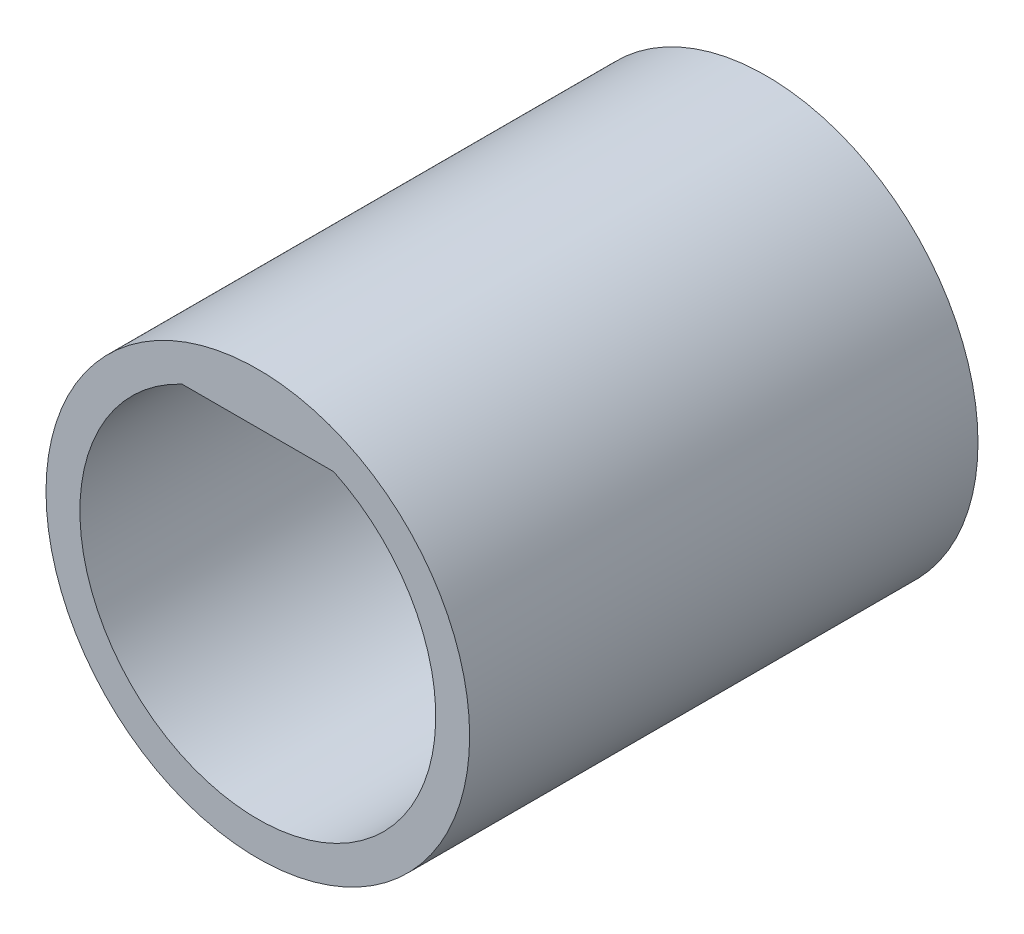
ISO-10303-21;
HEADER;
FILE_DESCRIPTION(('STEP AP214'),'2;1');
FILE_NAME('part.step','',(''),(''),'','','');
FILE_SCHEMA(('AUTOMOTIVE_DESIGN { 1 0 10303 214 1 1 1 1 }'));
ENDSEC;
DATA;
#1=APPLICATION_CONTEXT('core data for automotive mechanical design processes');
#2=APPLICATION_PROTOCOL_DEFINITION('international standard','automotive_design',2000,#1);
#3=PRODUCT_CONTEXT('',#1,'mechanical');
#4=PRODUCT('Part','Part','',(#3));
#5=PRODUCT_RELATED_PRODUCT_CATEGORY('part','',(#4));
#6=PRODUCT_DEFINITION_FORMATION('','',#4);
#7=PRODUCT_DEFINITION_CONTEXT('part definition',#1,'design');
#8=PRODUCT_DEFINITION('design','',#6,#7);
#9=PRODUCT_DEFINITION_SHAPE('','',#8);
#10=(LENGTH_UNIT() NAMED_UNIT(*) SI_UNIT(.MILLI.,.METRE.));
#11=(NAMED_UNIT(*) PLANE_ANGLE_UNIT() SI_UNIT($,.RADIAN.));
#12=(NAMED_UNIT(*) SI_UNIT($,.STERADIAN.) SOLID_ANGLE_UNIT());
#13=UNCERTAINTY_MEASURE_WITH_UNIT(LENGTH_MEASURE(1.E-05),#10,'distance_accuracy_value','');
#14=(GEOMETRIC_REPRESENTATION_CONTEXT(3) GLOBAL_UNCERTAINTY_ASSIGNED_CONTEXT((#13)) GLOBAL_UNIT_ASSIGNED_CONTEXT((#10,
#11,#12)) REPRESENTATION_CONTEXT('',''));
#15=CARTESIAN_POINT('',(0.,0.,0.));
#16=DIRECTION('',(0.,0.,1.));
#17=DIRECTION('',(1.,0.,0.));
#18=AXIS2_PLACEMENT_3D('',#15,#16,#17);
#19=CARTESIAN_POINT('',(0.,0.,7.62));
#20=DIRECTION('',(0.,0.,1.));
#21=DIRECTION('',(1.,0.,0.));
#22=AXIS2_PLACEMENT_3D('',#19,#20,#21);
#23=PLANE('',#22);
#24=CARTESIAN_POINT('',(0.,0.,7.62));
#25=DIRECTION('',(0.,0.,1.));
#26=DIRECTION('',(1.,0.,0.));
#27=AXIS2_PLACEMENT_3D('',#24,#25,#26);
#28=CIRCLE('',#27,3.175);
#29=CARTESIAN_POINT('',(-3.175,0.,7.62));
#30=VERTEX_POINT('',#29);
#31=EDGE_CURVE('E11',#30,#30,#28,.T.);
#32=ORIENTED_EDGE('',*,*,#31,.T.);
#33=EDGE_LOOP('',(#32));
#34=FACE_BOUND('',#33,.T.);
#35=DIRECTION('',(-1.,0.,0.));
#36=VECTOR('',#35,1.);
#37=CARTESIAN_POINT('',(-1.13592253256989,2.413,7.62));
#38=LINE('',#37,#36);
#39=CARTESIAN_POINT('',(1.13592253256989,2.413,7.62));
#40=VERTEX_POINT('',#39);
#41=CARTESIAN_POINT('',(-1.13592253256989,2.413,7.62));
#42=VERTEX_POINT('',#41);
#43=EDGE_CURVE('E79',#40,#42,#38,.T.);
#44=ORIENTED_EDGE('',*,*,#43,.F.);
#45=CARTESIAN_POINT('',(0.,0.,7.62));
#46=DIRECTION('',(0.,0.,1.));
#47=DIRECTION('',(1.,0.,0.));
#48=AXIS2_PLACEMENT_3D('',#45,#46,#47);
#49=CIRCLE('',#48,2.667);
#50=EDGE_CURVE('E70',#42,#40,#49,.T.);
#51=ORIENTED_EDGE('',*,*,#50,.F.);
#52=EDGE_LOOP('',(#44,#51));
#53=FACE_BOUND('',#52,.T.);
#54=ADVANCED_FACE('F38',(#34,#53),#23,.T.);
#55=CARTESIAN_POINT('',(0.,0.,0.));
#56=DIRECTION('',(0.,0.,1.));
#57=DIRECTION('',(1.,0.,0.));
#58=AXIS2_PLACEMENT_3D('',#55,#56,#57);
#59=PLANE('',#58);
#60=CARTESIAN_POINT('',(0.,0.,0.));
#61=DIRECTION('',(0.,0.,1.));
#62=DIRECTION('',(1.,0.,0.));
#63=AXIS2_PLACEMENT_3D('',#60,#61,#62);
#64=CIRCLE('',#63,3.175);
#65=CARTESIAN_POINT('',(-3.175,0.,0.));
#66=VERTEX_POINT('',#65);
#67=EDGE_CURVE('E42',#66,#66,#64,.T.);
#68=ORIENTED_EDGE('',*,*,#67,.F.);
#69=EDGE_LOOP('',(#68));
#70=FACE_BOUND('',#69,.T.);
#71=CARTESIAN_POINT('',(0.,0.,0.));
#72=DIRECTION('',(0.,0.,1.));
#73=DIRECTION('',(1.,0.,0.));
#74=AXIS2_PLACEMENT_3D('',#71,#72,#73);
#75=CIRCLE('',#74,2.667);
#76=CARTESIAN_POINT('',(-1.13592253256989,2.413,0.));
#77=VERTEX_POINT('',#76);
#78=CARTESIAN_POINT('',(1.13592253256989,2.413,0.));
#79=VERTEX_POINT('',#78);
#80=EDGE_CURVE('E60',#77,#79,#75,.T.);
#81=ORIENTED_EDGE('',*,*,#80,.T.);
#82=DIRECTION('',(-1.,0.,0.));
#83=VECTOR('',#82,1.);
#84=CARTESIAN_POINT('',(-1.13592253256989,2.413,0.));
#85=LINE('',#84,#83);
#86=EDGE_CURVE('E66',#79,#77,#85,.T.);
#87=ORIENTED_EDGE('',*,*,#86,.T.);
#88=EDGE_LOOP('',(#81,#87));
#89=FACE_BOUND('',#88,.T.);
#90=ADVANCED_FACE('F76',(#70,#89),#59,.F.);
#91=CARTESIAN_POINT('',(0.,0.,7.62));
#92=DIRECTION('',(0.,0.,-1.));
#93=DIRECTION('',(-1.,0.,0.));
#94=AXIS2_PLACEMENT_3D('',#91,#92,#93);
#95=CYLINDRICAL_SURFACE('',#94,3.175);
#96=CARTESIAN_POINT('',(-3.175,0.,7.62));
#97=CARTESIAN_POINT('',(-3.175,0.,7.540625));
#98=CARTESIAN_POINT('',(-3.175,0.,7.46125));
#99=CARTESIAN_POINT('',(-3.175,0.,7.3025));
#100=CARTESIAN_POINT('',(-3.175,0.,7.223125));
#101=CARTESIAN_POINT('',(-3.175,0.,7.064375));
#102=CARTESIAN_POINT('',(-3.175,0.,6.985));
#103=CARTESIAN_POINT('',(-3.175,0.,6.82625));
#104=CARTESIAN_POINT('',(-3.175,0.,6.746875));
#105=CARTESIAN_POINT('',(-3.175,0.,6.588125));
#106=CARTESIAN_POINT('',(-3.175,0.,6.50875));
#107=CARTESIAN_POINT('',(-3.175,0.,6.35));
#108=CARTESIAN_POINT('',(-3.175,0.,6.270625));
#109=CARTESIAN_POINT('',(-3.175,0.,6.111875));
#110=CARTESIAN_POINT('',(-3.175,0.,6.0325));
#111=CARTESIAN_POINT('',(-3.175,0.,5.87375));
#112=CARTESIAN_POINT('',(-3.175,0.,5.794375));
#113=CARTESIAN_POINT('',(-3.175,0.,5.635625));
#114=CARTESIAN_POINT('',(-3.175,0.,5.55625));
#115=CARTESIAN_POINT('',(-3.175,0.,5.3975));
#116=CARTESIAN_POINT('',(-3.175,0.,5.318125));
#117=CARTESIAN_POINT('',(-3.175,0.,5.159375));
#118=CARTESIAN_POINT('',(-3.175,0.,5.08));
#119=CARTESIAN_POINT('',(-3.175,0.,4.92125));
#120=CARTESIAN_POINT('',(-3.175,0.,4.841875));
#121=CARTESIAN_POINT('',(-3.175,0.,4.683125));
#122=CARTESIAN_POINT('',(-3.175,0.,4.60375));
#123=CARTESIAN_POINT('',(-3.175,0.,4.445));
#124=CARTESIAN_POINT('',(-3.175,0.,4.365625));
#125=CARTESIAN_POINT('',(-3.175,0.,4.206875));
#126=CARTESIAN_POINT('',(-3.175,0.,4.1275));
#127=CARTESIAN_POINT('',(-3.175,0.,3.96875));
#128=CARTESIAN_POINT('',(-3.175,0.,3.889375));
#129=CARTESIAN_POINT('',(-3.175,0.,3.730625));
#130=CARTESIAN_POINT('',(-3.175,0.,3.65125));
#131=CARTESIAN_POINT('',(-3.175,0.,3.4925));
#132=CARTESIAN_POINT('',(-3.175,0.,3.413125));
#133=CARTESIAN_POINT('',(-3.175,0.,3.254375));
#134=CARTESIAN_POINT('',(-3.175,0.,3.175));
#135=CARTESIAN_POINT('',(-3.175,0.,3.01625));
#136=CARTESIAN_POINT('',(-3.175,0.,2.936875));
#137=CARTESIAN_POINT('',(-3.175,0.,2.778125));
#138=CARTESIAN_POINT('',(-3.175,0.,2.69875));
#139=CARTESIAN_POINT('',(-3.175,0.,2.54));
#140=CARTESIAN_POINT('',(-3.175,0.,2.460625));
#141=CARTESIAN_POINT('',(-3.175,0.,2.301875));
#142=CARTESIAN_POINT('',(-3.175,0.,2.2225));
#143=CARTESIAN_POINT('',(-3.175,0.,2.06375));
#144=CARTESIAN_POINT('',(-3.175,0.,1.984375));
#145=CARTESIAN_POINT('',(-3.175,0.,1.825625));
#146=CARTESIAN_POINT('',(-3.175,0.,1.74625));
#147=CARTESIAN_POINT('',(-3.175,0.,1.5875));
#148=CARTESIAN_POINT('',(-3.175,0.,1.508125));
#149=CARTESIAN_POINT('',(-3.175,0.,1.349375));
#150=CARTESIAN_POINT('',(-3.175,0.,1.27));
#151=CARTESIAN_POINT('',(-3.175,0.,1.11125));
#152=CARTESIAN_POINT('',(-3.175,0.,1.031875));
#153=CARTESIAN_POINT('',(-3.175,0.,0.873125));
#154=CARTESIAN_POINT('',(-3.175,0.,0.79375));
#155=CARTESIAN_POINT('',(-3.175,0.,0.635));
#156=CARTESIAN_POINT('',(-3.175,0.,0.555625));
#157=CARTESIAN_POINT('',(-3.175,0.,0.396875));
#158=CARTESIAN_POINT('',(-3.175,0.,0.3175));
#159=CARTESIAN_POINT('',(-3.175,0.,0.15875));
#160=CARTESIAN_POINT('',(-3.175,0.,0.0793749999999999));
#161=CARTESIAN_POINT('',(-3.175,0.,0.));
#162=B_SPLINE_CURVE_WITH_KNOTS('',3,(#96,#97,#98,#99,#100,#101,#102,#103,#104,#105,#106,#107,
#108,#109,#110,#111,#112,#113,#114,#115,#116,#117,#118,#119,#120,#121,#122,#123,#124,#125,#126,
#127,#128,#129,#130,#131,#132,#133,#134,#135,#136,#137,#138,#139,#140,#141,#142,#143,#144,#145,
#146,#147,#148,#149,#150,#151,#152,#153,#154,#155,#156,#157,#158,#159,#160,#161),.UNSPECIFIED.,
.F.,.F.,(4,2,2,2,2,2,2,2,2,2,2,2,2,2,2,2,2,2,2,2,2,2,2,2,2,2,2,2,2,2,2,2,4),(0.,0.238125,
0.47625,0.714375000000001,0.9525,1.190625,1.42875,1.666875,1.905,2.143125,2.38125,2.619375,
2.8575,3.095625,3.33375,3.571875,3.81,4.048125,4.28625,4.524375,4.7625,5.000625,5.23875,
5.476875,5.715,5.953125,6.19125,6.429375,6.6675,6.905625,7.14375,7.381875,7.62),.UNSPECIFIED.);
#163=EDGE_CURVE('BSEAM40',#30,#66,#162,.T.);
#164=ORIENTED_EDGE('',*,*,#31,.F.);
#165=ORIENTED_EDGE('',*,*,#67,.T.);
#166=ORIENTED_EDGE('',*,*,#163,.T.);
#167=ORIENTED_EDGE('',*,*,#163,.F.);
#168=EDGE_LOOP('',(#164,#166,#165,#167));
#169=FACE_BOUND('',#168,.T.);
#170=ADVANCED_FACE('F40',(#169),#95,.T.);
#171=CARTESIAN_POINT('',(0.,0.,7.62));
#172=DIRECTION('',(0.,0.,-1.));
#173=DIRECTION('',(-1.,0.,0.));
#174=AXIS2_PLACEMENT_3D('',#171,#172,#173);
#175=CYLINDRICAL_SURFACE('',#174,2.667);
#176=ORIENTED_EDGE('',*,*,#80,.F.);
#177=DIRECTION('',(0.,0.,-1.));
#178=VECTOR('',#177,1.);
#179=CARTESIAN_POINT('',(-1.13592253256989,2.413,7.62));
#180=LINE('',#179,#178);
#181=EDGE_CURVE('E68',#42,#77,#180,.T.);
#182=ORIENTED_EDGE('',*,*,#181,.F.);
#183=ORIENTED_EDGE('',*,*,#50,.T.);
#184=DIRECTION('',(0.,0.,-1.));
#185=VECTOR('',#184,1.);
#186=CARTESIAN_POINT('',(1.13592253256989,2.413,7.62));
#187=LINE('',#186,#185);
#188=EDGE_CURVE('E53',#40,#79,#187,.T.);
#189=ORIENTED_EDGE('',*,*,#188,.T.);
#190=EDGE_LOOP('',(#176,#182,#183,#189));
#191=FACE_BOUND('',#190,.T.);
#192=ADVANCED_FACE('F72',(#191),#175,.F.);
#193=CARTESIAN_POINT('',(-1.13592253256989,2.413,7.62));
#194=DIRECTION('',(0.,-1.,0.));
#195=DIRECTION('',(0.,0.,-1.));
#196=AXIS2_PLACEMENT_3D('',#193,#194,#195);
#197=PLANE('',#196);
#198=ORIENTED_EDGE('',*,*,#86,.F.);
#199=ORIENTED_EDGE('',*,*,#188,.F.);
#200=ORIENTED_EDGE('',*,*,#43,.T.);
#201=ORIENTED_EDGE('',*,*,#181,.T.);
#202=EDGE_LOOP('',(#198,#199,#200,#201));
#203=FACE_BOUND('',#202,.T.);
#204=ADVANCED_FACE('F67',(#203),#197,.T.);
#205=CLOSED_SHELL('',(#54,#90,#170,#192,#204));
#206=MANIFOLD_SOLID_BREP('B2',#205);
#207=ADVANCED_BREP_SHAPE_REPRESENTATION('',(#18,#206),#14);
#208=SHAPE_DEFINITION_REPRESENTATION(#9,#207);
ENDSEC;
END-ISO-10303-21;
